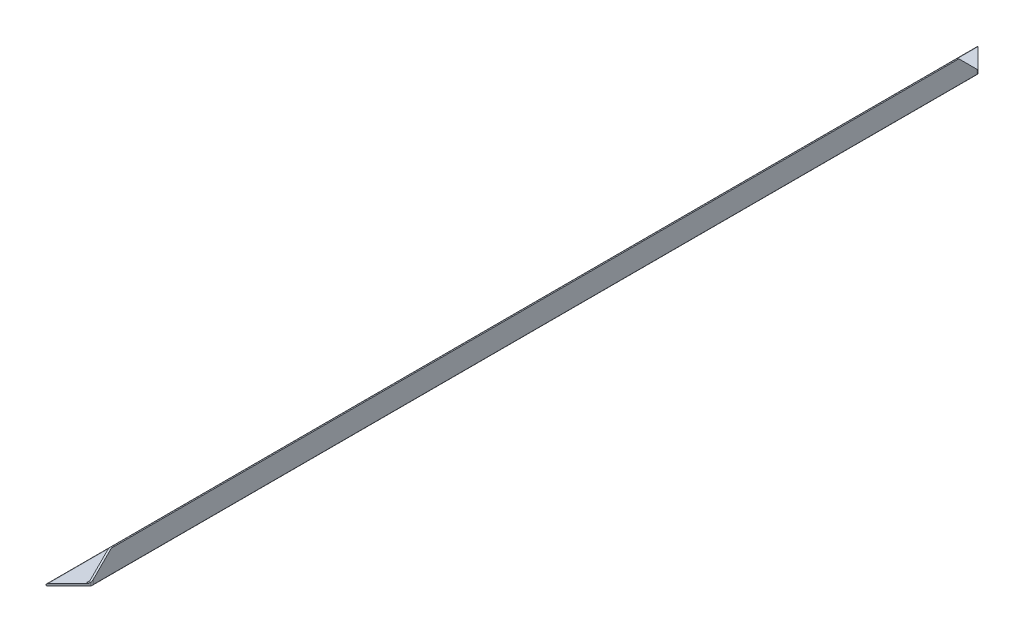
ISO-10303-21;
HEADER;
FILE_DESCRIPTION(('STEP AP214'),'2;1');
FILE_NAME('part.step','',(''),(''),'','','');
FILE_SCHEMA(('AUTOMOTIVE_DESIGN { 1 0 10303 214 1 1 1 1 }'));
ENDSEC;
DATA;
#1=APPLICATION_CONTEXT('core data for automotive mechanical design processes');
#2=APPLICATION_PROTOCOL_DEFINITION('international standard','automotive_design',2000,#1);
#3=PRODUCT_CONTEXT('',#1,'mechanical');
#4=PRODUCT('Part','Part','',(#3));
#5=PRODUCT_RELATED_PRODUCT_CATEGORY('part','',(#4));
#6=PRODUCT_DEFINITION_FORMATION('','',#4);
#7=PRODUCT_DEFINITION_CONTEXT('part definition',#1,'design');
#8=PRODUCT_DEFINITION('design','',#6,#7);
#9=PRODUCT_DEFINITION_SHAPE('','',#8);
#10=(LENGTH_UNIT() NAMED_UNIT(*) SI_UNIT(.MILLI.,.METRE.));
#11=(NAMED_UNIT(*) PLANE_ANGLE_UNIT() SI_UNIT($,.RADIAN.));
#12=(NAMED_UNIT(*) SI_UNIT($,.STERADIAN.) SOLID_ANGLE_UNIT());
#13=UNCERTAINTY_MEASURE_WITH_UNIT(LENGTH_MEASURE(1.E-05),#10,'distance_accuracy_value','');
#14=(GEOMETRIC_REPRESENTATION_CONTEXT(3) GLOBAL_UNCERTAINTY_ASSIGNED_CONTEXT((#13)) GLOBAL_UNIT_ASSIGNED_CONTEXT((#10,
#11,#12)) REPRESENTATION_CONTEXT('',''));
#15=CARTESIAN_POINT('',(0.,0.,0.));
#16=DIRECTION('',(0.,0.,1.));
#17=DIRECTION('',(1.,0.,0.));
#18=AXIS2_PLACEMENT_3D('',#15,#16,#17);
#19=CARTESIAN_POINT('',(-35.,0.,706.));
#20=DIRECTION('',(1.,0.,0.));
#21=DIRECTION('',(0.,0.,-1.));
#22=AXIS2_PLACEMENT_3D('',#19,#20,#21);
#23=PLANE('',#22);
#24=CARTESIAN_POINT('',(-35.,0.999999999999991,-705.));
#25=DIRECTION('',(1.,0.,0.));
#26=DIRECTION('',(0.,0.,-1.));
#27=AXIS2_PLACEMENT_3D('',#24,#25,#26);
#28=CIRCLE('',#27,1.);
#29=CARTESIAN_POINT('',(-35.,0.999999999999992,-706.));
#30=VERTEX_POINT('',#29);
#31=CARTESIAN_POINT('',(-35.,0.,-705.));
#32=VERTEX_POINT('',#31);
#33=EDGE_CURVE('E49',#30,#32,#28,.F.);
#34=ORIENTED_EDGE('',*,*,#33,.T.);
#35=DIRECTION('',(0.,0.,-1.));
#36=VECTOR('',#35,1.);
#37=CARTESIAN_POINT('',(-35.,0.,706.));
#38=LINE('',#37,#36);
#39=CARTESIAN_POINT('',(-35.,0.,705.));
#40=VERTEX_POINT('',#39);
#41=EDGE_CURVE('E163',#40,#32,#38,.T.);
#42=ORIENTED_EDGE('',*,*,#41,.F.);
#43=CARTESIAN_POINT('',(-35.,0.999999999999991,705.));
#44=DIRECTION('',(-1.,0.,0.));
#45=DIRECTION('',(0.,0.,1.));
#46=AXIS2_PLACEMENT_3D('',#43,#44,#45);
#47=CIRCLE('',#46,1.);
#48=CARTESIAN_POINT('',(-35.,0.999999999999991,706.));
#49=VERTEX_POINT('',#48);
#50=EDGE_CURVE('E173',#49,#40,#47,.F.);
#51=ORIENTED_EDGE('',*,*,#50,.F.);
#52=DIRECTION('',(0.,-1.,0.));
#53=VECTOR('',#52,1.);
#54=CARTESIAN_POINT('',(-35.,0.,706.));
#55=LINE('',#54,#53);
#56=CARTESIAN_POINT('',(-35.,1.5,706.));
#57=VERTEX_POINT('',#56);
#58=EDGE_CURVE('E170',#57,#49,#55,.T.);
#59=ORIENTED_EDGE('',*,*,#58,.F.);
#60=DIRECTION('',(0.,0.,-1.));
#61=VECTOR('',#60,1.);
#62=CARTESIAN_POINT('',(-35.,1.5,706.));
#63=LINE('',#62,#61);
#64=CARTESIAN_POINT('',(-35.,1.5,-706.));
#65=VERTEX_POINT('',#64);
#66=EDGE_CURVE('E237',#57,#65,#63,.T.);
#67=ORIENTED_EDGE('',*,*,#66,.T.);
#68=DIRECTION('',(0.,-1.,0.));
#69=VECTOR('',#68,1.);
#70=CARTESIAN_POINT('',(-35.,0.,-706.));
#71=LINE('',#70,#69);
#72=EDGE_CURVE('E177',#65,#30,#71,.T.);
#73=ORIENTED_EDGE('',*,*,#72,.T.);
#74=EDGE_LOOP('',(#34,#42,#51,#59,#67,#73));
#75=FACE_BOUND('',#74,.T.);
#76=ADVANCED_FACE('F34',(#75),#23,.F.);
#77=CARTESIAN_POINT('',(-35.,35.,-706.));
#78=DIRECTION('',(-0.707106781186544,0.,0.707106781186551));
#79=DIRECTION('',(0.707106781186551,0.,0.707106781186544));
#80=AXIS2_PLACEMENT_3D('',#77,#78,#79);
#81=PLANE('',#80);
#82=CARTESIAN_POINT('',(-34.,0.999999999999991,-705.));
#83=DIRECTION('',(-0.707106781186544,0.,0.707106781186551));
#84=DIRECTION('',(-0.707106781186551,0.,-0.707106781186544));
#85=AXIS2_PLACEMENT_3D('',#82,#83,#84);
#86=ELLIPSE('',#85,1.4142135623731,1.);
#87=CARTESIAN_POINT('',(-34.,0.,-705.));
#88=VERTEX_POINT('',#87);
#89=EDGE_CURVE('E11',#30,#88,#86,.T.);
#90=ORIENTED_EDGE('',*,*,#89,.F.);
#91=ORIENTED_EDGE('',*,*,#72,.F.);
#92=CARTESIAN_POINT('',(-33.5,1.5,-704.5));
#93=DIRECTION('',(-0.707106781186544,0.,0.707106781186551));
#94=DIRECTION('',(-0.707106781186551,0.,-0.707106781186544));
#95=AXIS2_PLACEMENT_3D('',#92,#93,#94);
#96=ELLIPSE('',#95,2.12132034355963,1.5);
#97=CARTESIAN_POINT('',(-33.4999999999999,3.,-704.5));
#98=VERTEX_POINT('',#97);
#99=EDGE_CURVE('E222',#65,#98,#96,.F.);
#100=ORIENTED_EDGE('',*,*,#99,.T.);
#101=DIRECTION('',(-0.707106781186551,0.,-0.707106781186544));
#102=VECTOR('',#101,1.);
#103=CARTESIAN_POINT('',(688.5,3.00000000000006,17.4999999999936));
#104=LINE('',#103,#102);
#105=CARTESIAN_POINT('',(-3.00000000000011,3.00000000000001,-674.));
#106=VERTEX_POINT('',#105);
#107=EDGE_CURVE('E220',#106,#98,#104,.T.);
#108=ORIENTED_EDGE('',*,*,#107,.F.);
#109=DIRECTION('',(0.577350269189632,0.577350269189618,0.577350269189627));
#110=VECTOR('',#109,1.);
#111=CARTESIAN_POINT('',(-13.666666666667,-7.66666666666662,-684.666666666667));
#112=LINE('',#111,#110);
#113=CARTESIAN_POINT('',(-1.17157287525381,4.82842712474628,-672.171572875254));
#114=VERTEX_POINT('',#113);
#115=EDGE_CURVE('E247',#106,#114,#112,.T.);
#116=ORIENTED_EDGE('',*,*,#115,.T.);
#117=DIRECTION('',(0.,-1.,0.));
#118=VECTOR('',#117,1.);
#119=CARTESIAN_POINT('',(-1.17157287525384,35.,-672.171572875254));
#120=LINE('',#119,#118);
#121=CARTESIAN_POINT('',(-1.17157287525382,0.,-672.171572875254));
#122=VERTEX_POINT('',#121);
#123=EDGE_CURVE('E383',#114,#122,#120,.T.);
#124=ORIENTED_EDGE('',*,*,#123,.T.);
#125=DIRECTION('',(-0.707106781186551,0.,-0.707106781186544));
#126=VECTOR('',#125,1.);
#127=CARTESIAN_POINT('',(-35.,0.,-706.));
#128=LINE('',#127,#126);
#129=EDGE_CURVE('E218',#122,#88,#128,.T.);
#130=ORIENTED_EDGE('',*,*,#129,.T.);
#131=EDGE_LOOP('',(#90,#91,#100,#108,#116,#124,#130));
#132=FACE_BOUND('',#131,.T.);
#133=ADVANCED_FACE('F344',(#132),#81,.F.);
#134=CARTESIAN_POINT('',(-10.,31.,640.343145750508));
#135=DIRECTION('',(-1.,0.,0.));
#136=DIRECTION('',(0.,0.,1.));
#137=AXIS2_PLACEMENT_3D('',#134,#135,#136);
#138=CYLINDRICAL_SURFACE('',#137,4.);
#139=DIRECTION('',(-1.,0.,0.));
#140=VECTOR('',#139,1.);
#141=CARTESIAN_POINT('',(-10.,33.8284271247462,643.171572875254));
#142=LINE('',#141,#140);
#143=CARTESIAN_POINT('',(0.,33.8284271247462,643.171572875254));
#144=VERTEX_POINT('',#143);
#145=CARTESIAN_POINT('',(-2.96360364297542,33.8284271247462,643.171572875254));
#146=VERTEX_POINT('',#145);
#147=EDGE_CURVE('E291',#144,#146,#142,.T.);
#148=ORIENTED_EDGE('',*,*,#147,.F.);
#149=CARTESIAN_POINT('',(0.,31.,640.343145750508));
#150=DIRECTION('',(-1.,0.,0.));
#151=DIRECTION('',(0.,0.,1.));
#152=AXIS2_PLACEMENT_3D('',#149,#150,#151);
#153=CIRCLE('',#152,4.);
#154=CARTESIAN_POINT('',(0.,35.,640.343145750507));
#155=VERTEX_POINT('',#154);
#156=EDGE_CURVE('E286',#155,#144,#153,.F.);
#157=ORIENTED_EDGE('',*,*,#156,.F.);
#158=DIRECTION('',(-1.,0.,0.));
#159=VECTOR('',#158,1.);
#160=CARTESIAN_POINT('',(0.,35.,640.343145750508));
#161=LINE('',#160,#159);
#162=CARTESIAN_POINT('',(-1.5,35.,640.343145750508));
#163=VERTEX_POINT('',#162);
#164=EDGE_CURVE('E288',#163,#155,#161,.F.);
#165=ORIENTED_EDGE('',*,*,#164,.F.);
#166=CARTESIAN_POINT('',(-2.96360364297543,33.8284271247462,643.171572875254));
#167=CARTESIAN_POINT('',(-2.95042793817217,33.8870469736708,643.11296342564));
#168=CARTESIAN_POINT('',(-2.93410158059202,33.943425387626,643.052931400823));
#169=CARTESIAN_POINT('',(-2.89610972541667,34.05151376938,642.930595661439));
#170=CARTESIAN_POINT('',(-2.87445405464259,34.1032320928853,642.868296305807));
#171=CARTESIAN_POINT('',(-2.8268801777611,34.2016792283383,642.742230512157));
#172=CARTESIAN_POINT('',(-2.8009933232614,34.2484408549212,642.678477628848));
#173=CARTESIAN_POINT('',(-2.74555771557699,34.3374588296447,642.54939127964));
#174=CARTESIAN_POINT('',(-2.71600667833098,34.379712336821,642.484056848511));
#175=CARTESIAN_POINT('',(-2.63986216382553,34.4778142920919,642.32237269966));
#176=CARTESIAN_POINT('',(-2.59159023403141,34.53120736564,642.225315396167));
#177=CARTESIAN_POINT('',(-2.49019310911075,34.6289264523714,642.029236705476));
#178=CARTESIAN_POINT('',(-2.43706648531687,34.6732497839472,641.930214746863));
#179=CARTESIAN_POINT('',(-2.27182918076888,34.7934021678222,641.630239628841));
#180=CARTESIAN_POINT('',(-2.15413894389455,34.8560783787703,641.426941929236));
#181=CARTESIAN_POINT('',(-1.94743448712809,34.93462320455,641.078363444697));
#182=CARTESIAN_POINT('',(-1.86024545732854,34.9588558413889,640.933724435039));
#183=CARTESIAN_POINT('',(-1.6842227133229,34.9913228814105,640.644003271307));
#184=CARTESIAN_POINT('',(-1.59539331656304,34.9995945217704,640.498922941525));
#185=CARTESIAN_POINT('',(-1.50440381956891,34.9999951497477,640.350337160676));
#186=CARTESIAN_POINT('',(-1.50220188956979,34.9999999979292,640.346741424153));
#187=CARTESIAN_POINT('',(-1.5,35.,640.343145750508));
#188=B_SPLINE_CURVE_WITH_KNOTS('',3,(#166,#167,#168,#169,#170,#171,#172,#173,#174,#175,#176,
#177,#178,#179,#180,#181,#182,#183,#184,#185,#186,#187),.UNSPECIFIED.,.F.,.F.,(4,2,2,2,2,2,2,2,
2,2,4),(0.,0.251589716144256,0.502718952296874,0.752065393728642,1.00156805361981,
1.36351788271683,1.72557457365589,2.45180246532626,2.96303602296817,3.47307541824615,
3.48572453724985),.UNSPECIFIED.);
#189=EDGE_CURVE('E43',#146,#163,#188,.T.);
#190=ORIENTED_EDGE('',*,*,#189,.F.);
#191=EDGE_LOOP('',(#148,#157,#165,#190));
#192=FACE_BOUND('',#191,.T.);
#193=ADVANCED_FACE('F36',(#192),#138,.T.);
#194=CARTESIAN_POINT('',(-4.,35.,669.343145750508));
#195=DIRECTION('',(0.,-1.,0.));
#196=DIRECTION('',(0.,0.,-1.));
#197=AXIS2_PLACEMENT_3D('',#194,#195,#196);
#198=CYLINDRICAL_SURFACE('',#197,4.);
#199=DIRECTION('',(0.,1.,0.));
#200=VECTOR('',#199,1.);
#201=CARTESIAN_POINT('',(-1.17157287525384,35.,672.171572875254));
#202=LINE('',#201,#200);
#203=CARTESIAN_POINT('',(-1.17157287525382,0.,672.171572875254));
#204=VERTEX_POINT('',#203);
#205=CARTESIAN_POINT('',(-1.17157287525381,4.82842712474628,672.171572875254));
#206=VERTEX_POINT('',#205);
#207=EDGE_CURVE('E409',#204,#206,#202,.T.);
#208=ORIENTED_EDGE('',*,*,#207,.F.);
#209=CARTESIAN_POINT('',(-4.,0.,669.343145750508));
#210=DIRECTION('',(0.,-1.,0.));
#211=DIRECTION('',(1.,0.,0.));
#212=AXIS2_PLACEMENT_3D('',#209,#210,#211);
#213=CIRCLE('',#212,4.);
#214=CARTESIAN_POINT('',(-1.00000000000001,0.,671.988897061573));
#215=VERTEX_POINT('',#214);
#216=EDGE_CURVE('E297',#215,#204,#213,.T.);
#217=ORIENTED_EDGE('',*,*,#216,.F.);
#218=CARTESIAN_POINT('',(0.,1.,669.343145750508));
#219=CARTESIAN_POINT('',(-7.77953545655207E-09,0.998114473669503,669.346916832471));
#220=CARTESIAN_POINT('',(-5.34044337655088E-06,0.996228852505332,669.350688074107));
#221=CARTESIAN_POINT('',(-0.00070537502409541,0.872392173403895,669.59836178253));
#222=CARTESIAN_POINT('',(-0.0236743147034582,0.750139995520649,669.842891686443));
#223=CARTESIAN_POINT('',(-0.0924620944862018,0.575367020757311,670.207145720452));
#224=CARTESIAN_POINT('',(-0.121193059998708,0.518452954399908,670.328346945257));
#225=CARTESIAN_POINT('',(-0.190543352944079,0.40927558892949,670.569415348144));
#226=CARTESIAN_POINT('',(-0.231152567848413,0.357008382872934,670.689283571338));
#227=CARTESIAN_POINT('',(-0.329150693169427,0.254713540122873,670.93827681112));
#228=CARTESIAN_POINT('',(-0.387763642874867,0.205365645566038,671.067204655159));
#229=CARTESIAN_POINT('',(-0.520147110880491,0.11912210799084,671.320744780613));
#230=CARTESIAN_POINT('',(-0.593832694662651,0.0821596249907914,671.445376859916));
#231=CARTESIAN_POINT('',(-0.706503055269114,0.0434675002096222,671.613845190508));
#232=CARTESIAN_POINT('',(-0.739022000179088,0.0340383201879641,671.660313406339));
#233=CARTESIAN_POINT('',(-0.806267181902423,0.0183379810108825,671.752150781023));
#234=CARTESIAN_POINT('',(-0.840992135405824,0.0120650043924339,671.797520558037));
#235=CARTESIAN_POINT('',(-0.912888607914675,0.00313640554568472,671.887370186274));
#236=CARTESIAN_POINT('',(-0.950079888922074,0.000514992781158238,671.931837825305));
#237=CARTESIAN_POINT('',(-1.0264427383824,-0.000377187067564662,672.019215819259));
#238=CARTESIAN_POINT('',(-1.06561777097127,0.00135993302188817,672.062123208272));
#239=CARTESIAN_POINT('',(-1.10563027937456,0.00559452732838674,672.10405573099));
#240=B_SPLINE_CURVE_WITH_KNOTS('',3,(#218,#219,#220,#221,#222,#223,#224,#225,#226,#227,#228,
#229,#230,#231,#232,#233,#234,#235,#236,#237,#238,#239),.UNSPECIFIED.,.F.,.F.,(4,2,2,2,2,2,2,2,
2,2,4),(0.,0.012649120759951,0.830689280150186,1.24112658478732,1.651215476291,2.10010321572959,
2.54652790049522,2.71890420004954,2.89118112478739,3.06506140224421,3.23925655920969),.UNSPECIFIED.);
#241=CARTESIAN_POINT('',(0.,1.00000000000001,669.343145750508));
#242=VERTEX_POINT('',#241);
#243=EDGE_CURVE('E299',#242,#215,#240,.T.);
#244=ORIENTED_EDGE('',*,*,#243,.F.);
#245=DIRECTION('',(0.,1.,0.));
#246=VECTOR('',#245,1.);
#247=CARTESIAN_POINT('',(0.,35.,669.343145750508));
#248=LINE('',#247,#246);
#249=CARTESIAN_POINT('',(0.,7.65685424949249,669.343145750508));
#250=VERTEX_POINT('',#249);
#251=EDGE_CURVE('E307',#250,#242,#248,.F.);
#252=ORIENTED_EDGE('',*,*,#251,.F.);
#253=CARTESIAN_POINT('',(-4.,7.65685424949239,669.343145750508));
#254=DIRECTION('',(0.,0.707106781186553,0.707106781186542));
#255=DIRECTION('',(0.,-0.707106781186542,0.707106781186553));
#256=AXIS2_PLACEMENT_3D('',#253,#254,#255);
#257=ELLIPSE('',#256,5.65685424949234,4.);
#258=EDGE_CURVE('E294',#206,#250,#257,.T.);
#259=ORIENTED_EDGE('',*,*,#258,.F.);
#260=EDGE_LOOP('',(#208,#217,#244,#252,#259));
#261=FACE_BOUND('',#260,.T.);
#262=ADVANCED_FACE('F309',(#261),#198,.T.);
#263=CARTESIAN_POINT('',(-4.,35.,-669.343145750508));
#264=DIRECTION('',(0.,-1.,0.));
#265=DIRECTION('',(0.,0.,-1.));
#266=AXIS2_PLACEMENT_3D('',#263,#264,#265);
#267=CYLINDRICAL_SURFACE('',#266,4.);
#268=ORIENTED_EDGE('',*,*,#123,.F.);
#269=CARTESIAN_POINT('',(-4.,7.65685424949239,-669.343145750508));
#270=DIRECTION('',(0.,-0.707106781186553,0.707106781186542));
#271=DIRECTION('',(0.,-0.707106781186542,-0.707106781186553));
#272=AXIS2_PLACEMENT_3D('',#269,#270,#271);
#273=ELLIPSE('',#272,5.65685424949234,4.);
#274=CARTESIAN_POINT('',(0.,7.65685424949249,-669.343145750508));
#275=VERTEX_POINT('',#274);
#276=EDGE_CURVE('E397',#275,#114,#273,.F.);
#277=ORIENTED_EDGE('',*,*,#276,.F.);
#278=DIRECTION('',(0.,-1.,0.));
#279=VECTOR('',#278,1.);
#280=CARTESIAN_POINT('',(0.,3.396445311831E-13,-669.343145750508));
#281=LINE('',#280,#279);
#282=CARTESIAN_POINT('',(0.,1.00000000000001,-669.343145750508));
#283=VERTEX_POINT('',#282);
#284=EDGE_CURVE('E329',#283,#275,#281,.F.);
#285=ORIENTED_EDGE('',*,*,#284,.F.);
#286=CARTESIAN_POINT('',(-0.999999999999998,0.,-671.988897061573));
#287=CARTESIAN_POINT('',(-0.956918705198486,2.22582876931001E-05,-671.940062181257));
#288=CARTESIAN_POINT('',(-0.915087742009775,0.00278131305152072,-671.890212036888));
#289=CARTESIAN_POINT('',(-0.834192161693904,0.0129960670940191,-671.788924181895));
#290=CARTESIAN_POINT('',(-0.795122393083181,0.0204427489323005,-671.737489699277));
#291=CARTESIAN_POINT('',(-0.720152911928803,0.0391856104888103,-671.63370796685));
#292=CARTESIAN_POINT('',(-0.684230096010443,0.0504501374583738,-671.581371477702));
#293=CARTESIAN_POINT('',(-0.615235827336075,0.0762500975185269,-671.475599957762));
#294=CARTESIAN_POINT('',(-0.582166268518094,0.0907876804457471,-671.422164226014));
#295=CARTESIAN_POINT('',(-0.50130309554913,0.131471696564133,-671.284427082475));
#296=CARTESIAN_POINT('',(-0.455555249107932,0.159576626234912,-671.199495373275));
#297=CARTESIAN_POINT('',(-0.370937707086513,0.220892201716607,-671.028094858466));
#298=CARTESIAN_POINT('',(-0.332070438669037,0.254104641540867,-670.94162552224));
#299=CARTESIAN_POINT('',(-0.225166535202669,0.359895498517374,-670.679673919891));
#300=CARTESIAN_POINT('',(-0.167245443106061,0.438393914262648,-670.502371196305));
#301=CARTESIAN_POINT('',(-0.0814906327009512,0.595602375920683,-670.163373360337));
#302=CARTESIAN_POINT('',(-0.0512343102340112,0.67351220939685,-670.001883120235));
#303=CARTESIAN_POINT('',(-0.0107531658422513,0.832415364691367,-669.678368930724));
#304=CARTESIAN_POINT('',(-0.000473725006484851,0.913399659947641,-669.516347653211));
#305=CARTESIAN_POINT('',(-5.33698662660908E-06,0.996228802114783,-669.35068815253));
#306=CARTESIAN_POINT('',(-4.10681571300052E-09,0.998114422762277,-669.346916911493));
#307=CARTESIAN_POINT('',(0.,1.,-669.343145750508));
#308=B_SPLINE_CURVE_WITH_KNOTS('',3,(#286,#287,#288,#289,#290,#291,#292,#293,#294,#295,#296,
#297,#298,#299,#300,#301,#302,#303,#304,#305,#306,#307),.UNSPECIFIED.,.F.,.F.,(4,2,2,2,2,2,2,2,
2,2,4),(0.,0.195194368709405,0.390014390844782,0.58325719329098,0.776627295352145,
1.0775931323777,1.37866492615889,1.98338003354322,2.52784959857828,3.07082842010454,
3.08347754086455),.UNSPECIFIED.);
#309=CARTESIAN_POINT('',(-1.00000000000001,0.,-671.988897061572));
#310=VERTEX_POINT('',#309);
#311=EDGE_CURVE('E321',#310,#283,#308,.T.);
#312=ORIENTED_EDGE('',*,*,#311,.F.);
#313=CARTESIAN_POINT('',(-4.,0.,-669.343145750508));
#314=DIRECTION('',(0.,-1.,0.));
#315=DIRECTION('',(1.,0.,0.));
#316=AXIS2_PLACEMENT_3D('',#313,#314,#315);
#317=CIRCLE('',#316,4.);
#318=EDGE_CURVE('E330',#122,#310,#317,.T.);
#319=ORIENTED_EDGE('',*,*,#318,.F.);
#320=EDGE_LOOP('',(#268,#277,#285,#312,#319));
#321=FACE_BOUND('',#320,.T.);
#322=ADVANCED_FACE('F332',(#321),#267,.T.);
#323=CARTESIAN_POINT('',(-10.,31.,-640.343145750508));
#324=DIRECTION('',(-1.,0.,0.));
#325=DIRECTION('',(0.,0.,1.));
#326=AXIS2_PLACEMENT_3D('',#323,#324,#325);
#327=CYLINDRICAL_SURFACE('',#326,4.);
#328=DIRECTION('',(1.,0.,0.));
#329=VECTOR('',#328,1.);
#330=CARTESIAN_POINT('',(-10.,33.8284271247462,-643.171572875254));
#331=LINE('',#330,#329);
#332=CARTESIAN_POINT('',(-2.96360364297542,33.8284271247462,-643.171572875254));
#333=VERTEX_POINT('',#332);
#334=CARTESIAN_POINT('',(0.,33.8284271247462,-643.171572875254));
#335=VERTEX_POINT('',#334);
#336=EDGE_CURVE('E252',#333,#335,#331,.T.);
#337=ORIENTED_EDGE('',*,*,#336,.F.);
#338=CARTESIAN_POINT('',(-2.96360364297543,33.8284271247462,-643.171572875254));
#339=CARTESIAN_POINT('',(-2.95042793817217,33.8870469736708,-643.11296342564));
#340=CARTESIAN_POINT('',(-2.93410158059202,33.943425387626,-643.052931400823));
#341=CARTESIAN_POINT('',(-2.89610972541667,34.05151376938,-642.930595661439));
#342=CARTESIAN_POINT('',(-2.87445405464259,34.1032320928853,-642.868296305807));
#343=CARTESIAN_POINT('',(-2.8268801777611,34.2016792283383,-642.742230512157));
#344=CARTESIAN_POINT('',(-2.8009933232614,34.2484408549212,-642.678477628848));
#345=CARTESIAN_POINT('',(-2.74555771557699,34.3374588296447,-642.54939127964));
#346=CARTESIAN_POINT('',(-2.71600667833098,34.379712336821,-642.484056848511));
#347=CARTESIAN_POINT('',(-2.63986216382553,34.4778142920919,-642.32237269966));
#348=CARTESIAN_POINT('',(-2.59159023403141,34.53120736564,-642.225315396167));
#349=CARTESIAN_POINT('',(-2.49019310911075,34.6289264523714,-642.029236705476));
#350=CARTESIAN_POINT('',(-2.43706648531687,34.6732497839472,-641.930214746863));
#351=CARTESIAN_POINT('',(-2.27182918076888,34.7934021678222,-641.630239628841));
#352=CARTESIAN_POINT('',(-2.15413894389455,34.8560783787703,-641.426941929236));
#353=CARTESIAN_POINT('',(-1.94743448712809,34.93462320455,-641.078363444697));
#354=CARTESIAN_POINT('',(-1.86024545732854,34.9588558413889,-640.933724435039));
#355=CARTESIAN_POINT('',(-1.6842227133229,34.9913228814105,-640.644003271307));
#356=CARTESIAN_POINT('',(-1.59539331656304,34.9995945217704,-640.498922941525));
#357=CARTESIAN_POINT('',(-1.50440381956891,34.9999951497477,-640.350337160676));
#358=CARTESIAN_POINT('',(-1.50220188956979,34.9999999979292,-640.346741424153));
#359=CARTESIAN_POINT('',(-1.5,35.,-640.343145750508));
#360=B_SPLINE_CURVE_WITH_KNOTS('',3,(#338,#339,#340,#341,#342,#343,#344,#345,#346,#347,#348,
#349,#350,#351,#352,#353,#354,#355,#356,#357,#358,#359),.UNSPECIFIED.,.F.,.F.,(4,2,2,2,2,2,2,2,
2,2,4),(0.,0.251589716144256,0.502718952296874,0.752065393728642,1.00156805361981,
1.36351788271683,1.72557457365589,2.45180246532626,2.96303602296817,3.47307541824615,
3.48572453724985),.UNSPECIFIED.);
#361=CARTESIAN_POINT('',(-1.5,35.,-640.343145750507));
#362=VERTEX_POINT('',#361);
#363=EDGE_CURVE('E258',#362,#333,#360,.F.);
#364=ORIENTED_EDGE('',*,*,#363,.F.);
#365=DIRECTION('',(1.,0.,0.));
#366=VECTOR('',#365,1.);
#367=CARTESIAN_POINT('',(-10.,35.,-640.343145750508));
#368=LINE('',#367,#366);
#369=CARTESIAN_POINT('',(0.,35.,-640.343145750507));
#370=VERTEX_POINT('',#369);
#371=EDGE_CURVE('E255',#370,#362,#368,.F.);
#372=ORIENTED_EDGE('',*,*,#371,.F.);
#373=CARTESIAN_POINT('',(0.,31.,-640.343145750508));
#374=DIRECTION('',(-1.,0.,0.));
#375=DIRECTION('',(0.,0.,1.));
#376=AXIS2_PLACEMENT_3D('',#373,#374,#375);
#377=CIRCLE('',#376,4.);
#378=EDGE_CURVE('E266',#335,#370,#377,.F.);
#379=ORIENTED_EDGE('',*,*,#378,.F.);
#380=EDGE_LOOP('',(#337,#364,#372,#379));
#381=FACE_BOUND('',#380,.T.);
#382=ADVANCED_FACE('F268',(#381),#327,.T.);
#383=CARTESIAN_POINT('',(0.,0.,706.));
#384=DIRECTION('',(-1.,0.,0.));
#385=DIRECTION('',(0.,0.,1.));
#386=AXIS2_PLACEMENT_3D('',#383,#384,#385);
#387=PLANE('',#386);
#388=DIRECTION('',(0.,0.,-1.));
#389=VECTOR('',#388,1.);
#390=CARTESIAN_POINT('',(0.,35.,706.));
#391=LINE('',#390,#389);
#392=EDGE_CURVE('E231',#155,#370,#391,.T.);
#393=ORIENTED_EDGE('',*,*,#392,.F.);
#394=ORIENTED_EDGE('',*,*,#156,.T.);
#395=DIRECTION('',(0.,-0.707106781186542,0.707106781186553));
#396=VECTOR('',#395,1.);
#397=CARTESIAN_POINT('',(0.,35.,642.));
#398=LINE('',#397,#396);
#399=EDGE_CURVE('E183',#144,#250,#398,.T.);
#400=ORIENTED_EDGE('',*,*,#399,.T.);
#401=ORIENTED_EDGE('',*,*,#251,.T.);
#402=DIRECTION('',(0.,0.,-1.));
#403=VECTOR('',#402,1.);
#404=CARTESIAN_POINT('',(0.,1.00000000000001,706.));
#405=LINE('',#404,#403);
#406=EDGE_CURVE('E233',#242,#283,#405,.T.);
#407=ORIENTED_EDGE('',*,*,#406,.T.);
#408=ORIENTED_EDGE('',*,*,#284,.T.);
#409=DIRECTION('',(0.,-0.707106781186542,-0.707106781186553));
#410=VECTOR('',#409,1.);
#411=CARTESIAN_POINT('',(0.,35.,-642.));
#412=LINE('',#411,#410);
#413=EDGE_CURVE('E203',#335,#275,#412,.T.);
#414=ORIENTED_EDGE('',*,*,#413,.F.);
#415=ORIENTED_EDGE('',*,*,#378,.T.);
#416=EDGE_LOOP('',(#393,#394,#400,#401,#407,#408,#414,#415));
#417=FACE_BOUND('',#416,.T.);
#418=ADVANCED_FACE('F317',(#417),#387,.F.);
#419=CARTESIAN_POINT('',(0.,35.,706.));
#420=DIRECTION('',(0.,1.,0.));
#421=DIRECTION('',(0.,0.,1.));
#422=AXIS2_PLACEMENT_3D('',#419,#420,#421);
#423=PLANE('',#422);
#424=DIRECTION('',(0.,0.,-1.));
#425=VECTOR('',#424,1.);
#426=CARTESIAN_POINT('',(-1.5,35.,706.));
#427=LINE('',#426,#425);
#428=EDGE_CURVE('E244',#362,#163,#427,.F.);
#429=ORIENTED_EDGE('',*,*,#428,.T.);
#430=ORIENTED_EDGE('',*,*,#164,.T.);
#431=ORIENTED_EDGE('',*,*,#392,.T.);
#432=ORIENTED_EDGE('',*,*,#371,.T.);
#433=EDGE_LOOP('',(#429,#430,#431,#432));
#434=FACE_BOUND('',#433,.T.);
#435=ADVANCED_FACE('F361',(#434),#423,.T.);
#436=CARTESIAN_POINT('',(-3.,0.,706.));
#437=DIRECTION('',(-1.,0.,0.));
#438=DIRECTION('',(0.,-1.,0.));
#439=AXIS2_PLACEMENT_3D('',#436,#437,#438);
#440=PLANE('',#439);
#441=DIRECTION('',(0.,0.,-1.));
#442=VECTOR('',#441,1.);
#443=CARTESIAN_POINT('',(-3.,6.00000000000002,706.));
#444=LINE('',#443,#442);
#445=CARTESIAN_POINT('',(-3.,6.00000000000002,671.));
#446=VERTEX_POINT('',#445);
#447=CARTESIAN_POINT('',(-3.,5.99999999999989,-671.000000000001));
#448=VERTEX_POINT('',#447);
#449=EDGE_CURVE('E229',#446,#448,#444,.T.);
#450=ORIENTED_EDGE('',*,*,#449,.F.);
#451=DIRECTION('',(0.,0.707106781186542,-0.707106781186553));
#452=VECTOR('',#451,1.);
#453=CARTESIAN_POINT('',(-3.,-14.4999999999998,691.5));
#454=LINE('',#453,#452);
#455=CARTESIAN_POINT('',(-3.,33.5,643.5));
#456=VERTEX_POINT('',#455);
#457=EDGE_CURVE('E191',#446,#456,#454,.T.);
#458=ORIENTED_EDGE('',*,*,#457,.T.);
#459=DIRECTION('',(0.,0.,-1.));
#460=VECTOR('',#459,1.);
#461=CARTESIAN_POINT('',(-3.,33.5,706.));
#462=LINE('',#461,#460);
#463=CARTESIAN_POINT('',(-3.,33.5,-643.5));
#464=VERTEX_POINT('',#463);
#465=EDGE_CURVE('E242',#456,#464,#462,.T.);
#466=ORIENTED_EDGE('',*,*,#465,.T.);
#467=DIRECTION('',(0.,0.707106781186542,0.707106781186553));
#468=VECTOR('',#467,1.);
#469=CARTESIAN_POINT('',(-3.00000000000002,691.5,14.5000000000098));
#470=LINE('',#469,#468);
#471=EDGE_CURVE('E212',#448,#464,#470,.T.);
#472=ORIENTED_EDGE('',*,*,#471,.F.);
#473=EDGE_LOOP('',(#450,#458,#466,#472));
#474=FACE_BOUND('',#473,.T.);
#475=ADVANCED_FACE('F358',(#474),#440,.T.);
#476=CARTESIAN_POINT('',(-6.,6.,706.));
#477=DIRECTION('',(0.,0.,-1.));
#478=DIRECTION('',(-1.,0.,0.));
#479=AXIS2_PLACEMENT_3D('',#476,#477,#478);
#480=CYLINDRICAL_SURFACE('',#479,3.);
#481=CARTESIAN_POINT('',(-6.,6.,671.));
#482=DIRECTION('',(0.,0.707106781186553,0.707106781186542));
#483=DIRECTION('',(0.,0.707106781186542,-0.707106781186553));
#484=AXIS2_PLACEMENT_3D('',#481,#482,#483);
#485=ELLIPSE('',#484,4.24264068711932,3.);
#486=CARTESIAN_POINT('',(-6.00000000000002,3.,674.));
#487=VERTEX_POINT('',#486);
#488=EDGE_CURVE('E194',#446,#487,#485,.F.);
#489=ORIENTED_EDGE('',*,*,#488,.F.);
#490=ORIENTED_EDGE('',*,*,#449,.T.);
#491=CARTESIAN_POINT('',(-6.,6.,-671.));
#492=DIRECTION('',(0.,-0.707106781186553,0.707106781186542));
#493=DIRECTION('',(0.,-0.707106781186542,-0.707106781186553));
#494=AXIS2_PLACEMENT_3D('',#491,#492,#493);
#495=ELLIPSE('',#494,4.24264068711932,3.);
#496=CARTESIAN_POINT('',(-6.00000000000002,3.,-674.));
#497=VERTEX_POINT('',#496);
#498=EDGE_CURVE('E215',#448,#497,#495,.F.);
#499=ORIENTED_EDGE('',*,*,#498,.T.);
#500=DIRECTION('',(0.,0.,-1.));
#501=VECTOR('',#500,1.);
#502=CARTESIAN_POINT('',(-6.00000000000002,3.,706.));
#503=LINE('',#502,#501);
#504=EDGE_CURVE('E169',#487,#497,#503,.T.);
#505=ORIENTED_EDGE('',*,*,#504,.F.);
#506=EDGE_LOOP('',(#489,#490,#499,#505));
#507=FACE_BOUND('',#506,.T.);
#508=ADVANCED_FACE('F276',(#507),#480,.F.);
#509=CARTESIAN_POINT('',(-1.5,33.5,706.));
#510=DIRECTION('',(0.,0.,-1.));
#511=DIRECTION('',(-1.,0.,0.));
#512=AXIS2_PLACEMENT_3D('',#509,#510,#511);
#513=CYLINDRICAL_SURFACE('',#512,1.5);
#514=CARTESIAN_POINT('',(-1.5,33.5,643.5));
#515=DIRECTION('',(0.,0.707106781186553,0.707106781186542));
#516=DIRECTION('',(0.,0.707106781186542,-0.707106781186553));
#517=AXIS2_PLACEMENT_3D('',#514,#515,#516);
#518=ELLIPSE('',#517,2.12132034355966,1.5);
#519=EDGE_CURVE('E188',#456,#146,#518,.F.);
#520=ORIENTED_EDGE('',*,*,#519,.T.);
#521=ORIENTED_EDGE('',*,*,#189,.T.);
#522=ORIENTED_EDGE('',*,*,#428,.F.);
#523=ORIENTED_EDGE('',*,*,#363,.T.);
#524=CARTESIAN_POINT('',(-1.5,33.5,-643.5));
#525=DIRECTION('',(0.,-0.707106781186553,0.707106781186542));
#526=DIRECTION('',(0.,-0.707106781186542,-0.707106781186553));
#527=AXIS2_PLACEMENT_3D('',#524,#525,#526);
#528=ELLIPSE('',#527,2.12132034355966,1.5);
#529=EDGE_CURVE('E209',#464,#333,#528,.F.);
#530=ORIENTED_EDGE('',*,*,#529,.F.);
#531=ORIENTED_EDGE('',*,*,#465,.F.);
#532=EDGE_LOOP('',(#520,#521,#522,#523,#530,#531));
#533=FACE_BOUND('',#532,.T.);
#534=ADVANCED_FACE('F271',(#533),#513,.T.);
#535=CARTESIAN_POINT('',(-35.,35.,706.));
#536=DIRECTION('',(0.707106781186544,0.,0.707106781186551));
#537=DIRECTION('',(0.707106781186551,0.,-0.707106781186544));
#538=AXIS2_PLACEMENT_3D('',#535,#536,#537);
#539=PLANE('',#538);
#540=CARTESIAN_POINT('',(-34.,0.999999999999991,705.));
#541=DIRECTION('',(0.707106781186544,0.,0.707106781186551));
#542=DIRECTION('',(-0.707106781186551,0.,0.707106781186544));
#543=AXIS2_PLACEMENT_3D('',#540,#541,#542);
#544=ELLIPSE('',#543,1.4142135623731,1.);
#545=CARTESIAN_POINT('',(-34.,0.,705.));
#546=VERTEX_POINT('',#545);
#547=EDGE_CURVE('E57',#546,#49,#544,.F.);
#548=ORIENTED_EDGE('',*,*,#547,.F.);
#549=DIRECTION('',(-0.707106781186551,0.,0.707106781186544));
#550=VECTOR('',#549,1.);
#551=CARTESIAN_POINT('',(-35.,0.,706.));
#552=LINE('',#551,#550);
#553=EDGE_CURVE('E196',#204,#546,#552,.T.);
#554=ORIENTED_EDGE('',*,*,#553,.F.);
#555=ORIENTED_EDGE('',*,*,#207,.T.);
#556=DIRECTION('',(-0.577350269189632,-0.577350269189618,0.577350269189627));
#557=VECTOR('',#556,1.);
#558=CARTESIAN_POINT('',(-13.666666666667,-7.66666666666662,684.666666666667));
#559=LINE('',#558,#557);
#560=CARTESIAN_POINT('',(-3.00000000000013,3.,674.));
#561=VERTEX_POINT('',#560);
#562=EDGE_CURVE('E250',#206,#561,#559,.T.);
#563=ORIENTED_EDGE('',*,*,#562,.T.);
#564=DIRECTION('',(-0.707106781186551,0.,0.707106781186544));
#565=VECTOR('',#564,1.);
#566=CARTESIAN_POINT('',(-17.4999999999999,3.,688.5));
#567=LINE('',#566,#565);
#568=CARTESIAN_POINT('',(-33.5,3.,704.5));
#569=VERTEX_POINT('',#568);
#570=EDGE_CURVE('E198',#561,#569,#567,.T.);
#571=ORIENTED_EDGE('',*,*,#570,.T.);
#572=CARTESIAN_POINT('',(-33.5,1.5,704.5));
#573=DIRECTION('',(0.707106781186544,0.,0.707106781186551));
#574=DIRECTION('',(0.707106781186551,0.,-0.707106781186544));
#575=AXIS2_PLACEMENT_3D('',#572,#573,#574);
#576=ELLIPSE('',#575,2.12132034355963,1.5);
#577=EDGE_CURVE('E200',#57,#569,#576,.F.);
#578=ORIENTED_EDGE('',*,*,#577,.F.);
#579=ORIENTED_EDGE('',*,*,#58,.T.);
#580=EDGE_LOOP('',(#548,#554,#555,#563,#571,#578,#579));
#581=FACE_BOUND('',#580,.T.);
#582=ADVANCED_FACE('F275',(#581),#539,.T.);
#583=CARTESIAN_POINT('',(0.,0.,706.));
#584=DIRECTION('',(0.,-1.,0.));
#585=DIRECTION('',(1.,0.,0.));
#586=AXIS2_PLACEMENT_3D('',#583,#584,#585);
#587=PLANE('',#586);
#588=DIRECTION('',(-1.,0.,0.));
#589=VECTOR('',#588,1.);
#590=CARTESIAN_POINT('',(-25.,0.,-705.));
#591=LINE('',#590,#589);
#592=EDGE_CURVE('E166',#88,#32,#591,.T.);
#593=ORIENTED_EDGE('',*,*,#592,.F.);
#594=ORIENTED_EDGE('',*,*,#129,.F.);
#595=ORIENTED_EDGE('',*,*,#318,.T.);
#596=DIRECTION('',(0.,0.,-1.));
#597=VECTOR('',#596,1.);
#598=CARTESIAN_POINT('',(-1.00000000000001,0.,706.));
#599=LINE('',#598,#597);
#600=EDGE_CURVE('E235',#215,#310,#599,.T.);
#601=ORIENTED_EDGE('',*,*,#600,.F.);
#602=ORIENTED_EDGE('',*,*,#216,.T.);
#603=ORIENTED_EDGE('',*,*,#553,.T.);
#604=DIRECTION('',(-1.,0.,0.));
#605=VECTOR('',#604,1.);
#606=CARTESIAN_POINT('',(-25.,0.,705.));
#607=LINE('',#606,#605);
#608=EDGE_CURVE('E167',#546,#40,#607,.T.);
#609=ORIENTED_EDGE('',*,*,#608,.T.);
#610=ORIENTED_EDGE('',*,*,#41,.T.);
#611=EDGE_LOOP('',(#593,#594,#595,#601,#602,#603,#609,#610));
#612=FACE_BOUND('',#611,.T.);
#613=ADVANCED_FACE('F164',(#612),#587,.T.);
#614=CARTESIAN_POINT('',(-1.,1.,706.));
#615=DIRECTION('',(0.,0.,-1.));
#616=DIRECTION('',(-1.,0.,0.));
#617=AXIS2_PLACEMENT_3D('',#614,#615,#616);
#618=CYLINDRICAL_SURFACE('',#617,1.);
#619=ORIENTED_EDGE('',*,*,#406,.F.);
#620=ORIENTED_EDGE('',*,*,#243,.T.);
#621=ORIENTED_EDGE('',*,*,#600,.T.);
#622=ORIENTED_EDGE('',*,*,#311,.T.);
#623=EDGE_LOOP('',(#619,#620,#621,#622));
#624=FACE_BOUND('',#623,.T.);
#625=ADVANCED_FACE('F311',(#624),#618,.T.);
#626=CARTESIAN_POINT('',(0.,3.,706.));
#627=DIRECTION('',(0.,-1.,0.));
#628=DIRECTION('',(1.,0.,0.));
#629=AXIS2_PLACEMENT_3D('',#626,#627,#628);
#630=PLANE('',#629);
#631=ORIENTED_EDGE('',*,*,#570,.F.);
#632=DIRECTION('',(1.,0.,0.));
#633=VECTOR('',#632,1.);
#634=CARTESIAN_POINT('',(-10.,3.,674.));
#635=LINE('',#634,#633);
#636=EDGE_CURVE('E185',#487,#561,#635,.T.);
#637=ORIENTED_EDGE('',*,*,#636,.F.);
#638=ORIENTED_EDGE('',*,*,#504,.T.);
#639=DIRECTION('',(1.,0.,0.));
#640=VECTOR('',#639,1.);
#641=CARTESIAN_POINT('',(-10.,3.,-674.));
#642=LINE('',#641,#640);
#643=EDGE_CURVE('E206',#497,#106,#642,.T.);
#644=ORIENTED_EDGE('',*,*,#643,.T.);
#645=ORIENTED_EDGE('',*,*,#107,.T.);
#646=DIRECTION('',(0.,0.,-1.));
#647=VECTOR('',#646,1.);
#648=CARTESIAN_POINT('',(-33.5,3.,706.));
#649=LINE('',#648,#647);
#650=EDGE_CURVE('E239',#98,#569,#649,.F.);
#651=ORIENTED_EDGE('',*,*,#650,.T.);
#652=EDGE_LOOP('',(#631,#637,#638,#644,#645,#651));
#653=FACE_BOUND('',#652,.T.);
#654=ADVANCED_FACE('F315',(#653),#630,.F.);
#655=CARTESIAN_POINT('',(-33.5,1.5,706.));
#656=DIRECTION('',(0.,0.,-1.));
#657=DIRECTION('',(-1.,0.,0.));
#658=AXIS2_PLACEMENT_3D('',#655,#656,#657);
#659=CYLINDRICAL_SURFACE('',#658,1.5);
#660=ORIENTED_EDGE('',*,*,#66,.F.);
#661=ORIENTED_EDGE('',*,*,#577,.T.);
#662=ORIENTED_EDGE('',*,*,#650,.F.);
#663=ORIENTED_EDGE('',*,*,#99,.F.);
#664=EDGE_LOOP('',(#660,#661,#662,#663));
#665=FACE_BOUND('',#664,.T.);
#666=ADVANCED_FACE('F278',(#665),#659,.T.);
#667=CARTESIAN_POINT('',(-10.,35.,-642.));
#668=DIRECTION('',(0.,-0.707106781186553,0.707106781186542));
#669=DIRECTION('',(0.,-0.707106781186542,-0.707106781186553));
#670=AXIS2_PLACEMENT_3D('',#667,#668,#669);
#671=PLANE('',#670);
#672=ORIENTED_EDGE('',*,*,#413,.T.);
#673=ORIENTED_EDGE('',*,*,#276,.T.);
#674=ORIENTED_EDGE('',*,*,#115,.F.);
#675=ORIENTED_EDGE('',*,*,#643,.F.);
#676=ORIENTED_EDGE('',*,*,#498,.F.);
#677=ORIENTED_EDGE('',*,*,#471,.T.);
#678=ORIENTED_EDGE('',*,*,#529,.T.);
#679=ORIENTED_EDGE('',*,*,#336,.T.);
#680=EDGE_LOOP('',(#672,#673,#674,#675,#676,#677,#678,#679));
#681=FACE_BOUND('',#680,.T.);
#682=ADVANCED_FACE('F385',(#681),#671,.F.);
#683=CARTESIAN_POINT('',(-10.,35.,642.));
#684=DIRECTION('',(0.,0.707106781186553,0.707106781186542));
#685=DIRECTION('',(0.,-0.707106781186542,0.707106781186553));
#686=AXIS2_PLACEMENT_3D('',#683,#684,#685);
#687=PLANE('',#686);
#688=ORIENTED_EDGE('',*,*,#399,.F.);
#689=ORIENTED_EDGE('',*,*,#147,.T.);
#690=ORIENTED_EDGE('',*,*,#519,.F.);
#691=ORIENTED_EDGE('',*,*,#457,.F.);
#692=ORIENTED_EDGE('',*,*,#488,.T.);
#693=ORIENTED_EDGE('',*,*,#636,.T.);
#694=ORIENTED_EDGE('',*,*,#562,.F.);
#695=ORIENTED_EDGE('',*,*,#258,.T.);
#696=EDGE_LOOP('',(#688,#689,#690,#691,#692,#693,#694,#695));
#697=FACE_BOUND('',#696,.T.);
#698=ADVANCED_FACE('F391',(#697),#687,.T.);
#699=CARTESIAN_POINT('',(-25.,0.999999999999991,705.));
#700=DIRECTION('',(-1.,0.,0.));
#701=DIRECTION('',(0.,0.,1.));
#702=AXIS2_PLACEMENT_3D('',#699,#700,#701);
#703=CYLINDRICAL_SURFACE('',#702,1.);
#704=ORIENTED_EDGE('',*,*,#547,.T.);
#705=ORIENTED_EDGE('',*,*,#50,.T.);
#706=ORIENTED_EDGE('',*,*,#608,.F.);
#707=EDGE_LOOP('',(#704,#705,#706));
#708=FACE_BOUND('',#707,.T.);
#709=ADVANCED_FACE('F405',(#708),#703,.T.);
#710=CARTESIAN_POINT('',(-25.,0.999999999999991,-705.));
#711=DIRECTION('',(-1.,0.,0.));
#712=DIRECTION('',(0.,0.,1.));
#713=AXIS2_PLACEMENT_3D('',#710,#711,#712);
#714=CYLINDRICAL_SURFACE('',#713,1.);
#715=ORIENTED_EDGE('',*,*,#89,.T.);
#716=ORIENTED_EDGE('',*,*,#592,.T.);
#717=ORIENTED_EDGE('',*,*,#33,.F.);
#718=EDGE_LOOP('',(#715,#716,#717));
#719=FACE_BOUND('',#718,.T.);
#720=ADVANCED_FACE('F172',(#719),#714,.T.);
#721=CLOSED_SHELL('',(#76,#133,#193,#262,#322,#382,#418,#435,#475,#508,#534,#582,#613,#625,#654,
#666,#682,#698,#709,#720));
#722=MANIFOLD_SOLID_BREP('B2',#721);
#723=ADVANCED_BREP_SHAPE_REPRESENTATION('',(#18,#722),#14);
#724=SHAPE_DEFINITION_REPRESENTATION(#9,#723);
ENDSEC;
END-ISO-10303-21;
